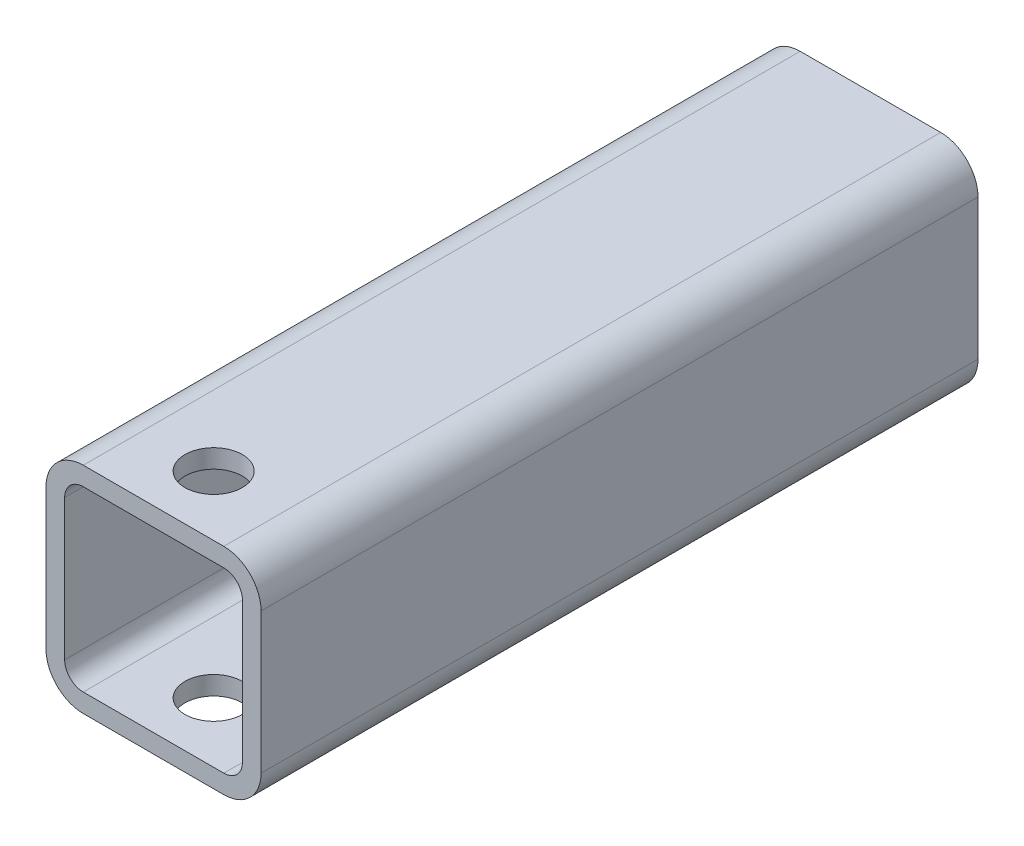
ISO-10303-21;
HEADER;
FILE_DESCRIPTION(('STEP AP214'),'2;1');
FILE_NAME('part.step','',(''),(''),'','','');
FILE_SCHEMA(('AUTOMOTIVE_DESIGN { 1 0 10303 214 1 1 1 1 }'));
ENDSEC;
DATA;
#1=APPLICATION_CONTEXT('core data for automotive mechanical design processes');
#2=APPLICATION_PROTOCOL_DEFINITION('international standard','automotive_design',2000,#1);
#3=PRODUCT_CONTEXT('',#1,'mechanical');
#4=PRODUCT('Part','Part','',(#3));
#5=PRODUCT_RELATED_PRODUCT_CATEGORY('part','',(#4));
#6=PRODUCT_DEFINITION_FORMATION('','',#4);
#7=PRODUCT_DEFINITION_CONTEXT('part definition',#1,'design');
#8=PRODUCT_DEFINITION('design','',#6,#7);
#9=PRODUCT_DEFINITION_SHAPE('','',#8);
#10=(LENGTH_UNIT() NAMED_UNIT(*) SI_UNIT(.MILLI.,.METRE.));
#11=(NAMED_UNIT(*) PLANE_ANGLE_UNIT() SI_UNIT($,.RADIAN.));
#12=(NAMED_UNIT(*) SI_UNIT($,.STERADIAN.) SOLID_ANGLE_UNIT());
#13=UNCERTAINTY_MEASURE_WITH_UNIT(LENGTH_MEASURE(1.E-05),#10,'distance_accuracy_value','');
#14=(GEOMETRIC_REPRESENTATION_CONTEXT(3) GLOBAL_UNCERTAINTY_ASSIGNED_CONTEXT((#13)) GLOBAL_UNIT_ASSIGNED_CONTEXT((#10,
#11,#12)) REPRESENTATION_CONTEXT('',''));
#15=CARTESIAN_POINT('',(0.,0.,0.));
#16=DIRECTION('',(0.,0.,1.));
#17=DIRECTION('',(1.,0.,0.));
#18=AXIS2_PLACEMENT_3D('',#15,#16,#17);
#19=CARTESIAN_POINT('',(-9.8,-12.4,31.9179648781356));
#20=DIRECTION('',(0.,1.,0.));
#21=DIRECTION('',(0.,0.,1.));
#22=AXIS2_PLACEMENT_3D('',#19,#20,#21);
#23=PLANE('',#22);
#24=CARTESIAN_POINT('',(0.,-12.4,23.5324288939167));
#25=DIRECTION('',(0.,1.,0.));
#26=DIRECTION('',(0.,0.,1.));
#27=AXIS2_PLACEMENT_3D('',#24,#25,#26);
#28=CIRCLE('',#27,4.);
#29=CARTESIAN_POINT('',(0.,-12.4,27.5324288939167));
#30=VERTEX_POINT('',#29);
#31=EDGE_CURVE('E177',#30,#30,#28,.T.);
#32=ORIENTED_EDGE('',*,*,#31,.F.);
#33=EDGE_LOOP('',(#32));
#34=FACE_BOUND('',#33,.T.);
#35=DIRECTION('',(0.,0.,-1.));
#36=VECTOR('',#35,1.);
#37=CARTESIAN_POINT('',(9.8,-12.4,31.9179648781356));
#38=LINE('',#37,#36);
#39=CARTESIAN_POINT('',(9.8,-12.4,31.9179648781356));
#40=VERTEX_POINT('',#39);
#41=CARTESIAN_POINT('',(9.8,-12.4,-68.0820351218644));
#42=VERTEX_POINT('',#41);
#43=EDGE_CURVE('E125',#40,#42,#38,.T.);
#44=ORIENTED_EDGE('',*,*,#43,.T.);
#45=DIRECTION('',(-1.,0.,0.));
#46=VECTOR('',#45,1.);
#47=CARTESIAN_POINT('',(-9.8,-12.4,-68.0820351218644));
#48=LINE('',#47,#46);
#49=CARTESIAN_POINT('',(-9.8,-12.4,-68.0820351218644));
#50=VERTEX_POINT('',#49);
#51=EDGE_CURVE('E156',#42,#50,#48,.T.);
#52=ORIENTED_EDGE('',*,*,#51,.T.);
#53=DIRECTION('',(0.,0.,-1.));
#54=VECTOR('',#53,1.);
#55=CARTESIAN_POINT('',(-9.8,-12.4,31.9179648781356));
#56=LINE('',#55,#54);
#57=CARTESIAN_POINT('',(-9.8,-12.4,31.9179648781356));
#58=VERTEX_POINT('',#57);
#59=EDGE_CURVE('E127',#58,#50,#56,.T.);
#60=ORIENTED_EDGE('',*,*,#59,.F.);
#61=DIRECTION('',(-1.,0.,0.));
#62=VECTOR('',#61,1.);
#63=CARTESIAN_POINT('',(-9.8,-12.4,31.9179648781356));
#64=LINE('',#63,#62);
#65=EDGE_CURVE('E123',#40,#58,#64,.T.);
#66=ORIENTED_EDGE('',*,*,#65,.F.);
#67=EDGE_LOOP('',(#44,#52,#60,#66));
#68=FACE_BOUND('',#67,.T.);
#69=ADVANCED_FACE('F43',(#34,#68),#23,.T.);
#70=CARTESIAN_POINT('',(9.8,-9.8,31.9179648781356));
#71=DIRECTION('',(0.,0.,-1.));
#72=DIRECTION('',(-1.,0.,0.));
#73=AXIS2_PLACEMENT_3D('',#70,#71,#72);
#74=CYLINDRICAL_SURFACE('',#73,2.6);
#75=DIRECTION('',(0.,0.,-1.));
#76=VECTOR('',#75,1.);
#77=CARTESIAN_POINT('',(12.4,-9.8,31.9179648781356));
#78=LINE('',#77,#76);
#79=CARTESIAN_POINT('',(12.4,-9.8,31.9179648781356));
#80=VERTEX_POINT('',#79);
#81=CARTESIAN_POINT('',(12.4,-9.8,-68.0820351218644));
#82=VERTEX_POINT('',#81);
#83=EDGE_CURVE('E140',#80,#82,#78,.T.);
#84=ORIENTED_EDGE('',*,*,#83,.T.);
#85=CARTESIAN_POINT('',(9.8,-9.8,-68.0820351218644));
#86=DIRECTION('',(0.,0.,-1.));
#87=DIRECTION('',(-1.,0.,0.));
#88=AXIS2_PLACEMENT_3D('',#85,#86,#87);
#89=CIRCLE('',#88,2.6);
#90=EDGE_CURVE('E131',#82,#42,#89,.T.);
#91=ORIENTED_EDGE('',*,*,#90,.T.);
#92=ORIENTED_EDGE('',*,*,#43,.F.);
#93=CARTESIAN_POINT('',(9.8,-9.8,31.9179648781356));
#94=DIRECTION('',(0.,0.,-1.));
#95=DIRECTION('',(-1.,0.,0.));
#96=AXIS2_PLACEMENT_3D('',#93,#94,#95);
#97=CIRCLE('',#96,2.6);
#98=EDGE_CURVE('E136',#80,#40,#97,.T.);
#99=ORIENTED_EDGE('',*,*,#98,.F.);
#100=EDGE_LOOP('',(#84,#91,#92,#99));
#101=FACE_BOUND('',#100,.T.);
#102=ADVANCED_FACE('F135',(#101),#74,.F.);
#103=CARTESIAN_POINT('',(12.4,9.8,31.9179648781356));
#104=DIRECTION('',(-1.,0.,0.));
#105=DIRECTION('',(0.,0.,1.));
#106=AXIS2_PLACEMENT_3D('',#103,#104,#105);
#107=PLANE('',#106);
#108=DIRECTION('',(0.,0.,-1.));
#109=VECTOR('',#108,1.);
#110=CARTESIAN_POINT('',(12.4,9.8,31.9179648781356));
#111=LINE('',#110,#109);
#112=CARTESIAN_POINT('',(12.4,9.8,31.9179648781356));
#113=VERTEX_POINT('',#112);
#114=CARTESIAN_POINT('',(12.4,9.8,-68.0820351218644));
#115=VERTEX_POINT('',#114);
#116=EDGE_CURVE('E180',#113,#115,#111,.T.);
#117=ORIENTED_EDGE('',*,*,#116,.T.);
#118=DIRECTION('',(0.,-1.,0.));
#119=VECTOR('',#118,1.);
#120=CARTESIAN_POINT('',(12.4,9.8,-68.0820351218644));
#121=LINE('',#120,#119);
#122=EDGE_CURVE('E317',#115,#82,#121,.T.);
#123=ORIENTED_EDGE('',*,*,#122,.T.);
#124=ORIENTED_EDGE('',*,*,#83,.F.);
#125=DIRECTION('',(0.,-1.,0.));
#126=VECTOR('',#125,1.);
#127=CARTESIAN_POINT('',(12.4,9.8,31.9179648781356));
#128=LINE('',#127,#126);
#129=EDGE_CURVE('E146',#113,#80,#128,.T.);
#130=ORIENTED_EDGE('',*,*,#129,.F.);
#131=EDGE_LOOP('',(#117,#123,#124,#130));
#132=FACE_BOUND('',#131,.T.);
#133=ADVANCED_FACE('F326',(#132),#107,.T.);
#134=CARTESIAN_POINT('',(9.8,9.8,31.9179648781356));
#135=DIRECTION('',(0.,0.,-1.));
#136=DIRECTION('',(-1.,0.,0.));
#137=AXIS2_PLACEMENT_3D('',#134,#135,#136);
#138=CYLINDRICAL_SURFACE('',#137,2.6);
#139=DIRECTION('',(0.,0.,-1.));
#140=VECTOR('',#139,1.);
#141=CARTESIAN_POINT('',(9.8,12.4,31.9179648781356));
#142=LINE('',#141,#140);
#143=CARTESIAN_POINT('',(9.8,12.4,31.9179648781356));
#144=VERTEX_POINT('',#143);
#145=CARTESIAN_POINT('',(9.8,12.4,-68.0820351218644));
#146=VERTEX_POINT('',#145);
#147=EDGE_CURVE('E184',#144,#146,#142,.T.);
#148=ORIENTED_EDGE('',*,*,#147,.T.);
#149=CARTESIAN_POINT('',(9.8,9.8,-68.0820351218644));
#150=DIRECTION('',(0.,0.,-1.));
#151=DIRECTION('',(-1.,0.,0.));
#152=AXIS2_PLACEMENT_3D('',#149,#150,#151);
#153=CIRCLE('',#152,2.6);
#154=EDGE_CURVE('E214',#146,#115,#153,.T.);
#155=ORIENTED_EDGE('',*,*,#154,.T.);
#156=ORIENTED_EDGE('',*,*,#116,.F.);
#157=CARTESIAN_POINT('',(9.8,9.8,31.9179648781356));
#158=DIRECTION('',(0.,0.,-1.));
#159=DIRECTION('',(-1.,0.,0.));
#160=AXIS2_PLACEMENT_3D('',#157,#158,#159);
#161=CIRCLE('',#160,2.6);
#162=EDGE_CURVE('E151',#144,#113,#161,.T.);
#163=ORIENTED_EDGE('',*,*,#162,.F.);
#164=EDGE_LOOP('',(#148,#155,#156,#163));
#165=FACE_BOUND('',#164,.T.);
#166=ADVANCED_FACE('F322',(#165),#138,.F.);
#167=CARTESIAN_POINT('',(9.8,12.4,31.9179648781356));
#168=DIRECTION('',(0.,-1.,0.));
#169=DIRECTION('',(0.,0.,-1.));
#170=AXIS2_PLACEMENT_3D('',#167,#168,#169);
#171=PLANE('',#170);
#172=CARTESIAN_POINT('',(0.,12.4,23.5324288939167));
#173=DIRECTION('',(0.,-1.,0.));
#174=DIRECTION('',(0.,0.,-1.));
#175=AXIS2_PLACEMENT_3D('',#172,#173,#174);
#176=CIRCLE('',#175,4.);
#177=CARTESIAN_POINT('',(0.,12.4,19.5324288939167));
#178=VERTEX_POINT('',#177);
#179=EDGE_CURVE('E366',#178,#178,#176,.T.);
#180=ORIENTED_EDGE('',*,*,#179,.F.);
#181=EDGE_LOOP('',(#180));
#182=FACE_BOUND('',#181,.T.);
#183=DIRECTION('',(0.,0.,-1.));
#184=VECTOR('',#183,1.);
#185=CARTESIAN_POINT('',(-9.8,12.4,31.9179648781356));
#186=LINE('',#185,#184);
#187=CARTESIAN_POINT('',(-9.8,12.4,31.9179648781356));
#188=VERTEX_POINT('',#187);
#189=CARTESIAN_POINT('',(-9.8,12.4,-68.0820351218644));
#190=VERTEX_POINT('',#189);
#191=EDGE_CURVE('E188',#188,#190,#186,.T.);
#192=ORIENTED_EDGE('',*,*,#191,.T.);
#193=DIRECTION('',(1.,0.,0.));
#194=VECTOR('',#193,1.);
#195=CARTESIAN_POINT('',(9.8,12.4,-68.0820351218644));
#196=LINE('',#195,#194);
#197=EDGE_CURVE('E207',#190,#146,#196,.T.);
#198=ORIENTED_EDGE('',*,*,#197,.T.);
#199=ORIENTED_EDGE('',*,*,#147,.F.);
#200=DIRECTION('',(1.,0.,0.));
#201=VECTOR('',#200,1.);
#202=CARTESIAN_POINT('',(9.8,12.4,31.9179648781356));
#203=LINE('',#202,#201);
#204=EDGE_CURVE('E161',#188,#144,#203,.T.);
#205=ORIENTED_EDGE('',*,*,#204,.F.);
#206=EDGE_LOOP('',(#192,#198,#199,#205));
#207=FACE_BOUND('',#206,.T.);
#208=ADVANCED_FACE('F333',(#182,#207),#171,.T.);
#209=CARTESIAN_POINT('',(-9.8,9.8,31.9179648781356));
#210=DIRECTION('',(0.,0.,-1.));
#211=DIRECTION('',(-1.,0.,0.));
#212=AXIS2_PLACEMENT_3D('',#209,#210,#211);
#213=CYLINDRICAL_SURFACE('',#212,2.6);
#214=DIRECTION('',(0.,0.,-1.));
#215=VECTOR('',#214,1.);
#216=CARTESIAN_POINT('',(-12.4,9.8,31.9179648781356));
#217=LINE('',#216,#215);
#218=CARTESIAN_POINT('',(-12.4,9.8,31.9179648781356));
#219=VERTEX_POINT('',#218);
#220=CARTESIAN_POINT('',(-12.4,9.8,-68.0820351218644));
#221=VERTEX_POINT('',#220);
#222=EDGE_CURVE('E154',#219,#221,#217,.T.);
#223=ORIENTED_EDGE('',*,*,#222,.T.);
#224=CARTESIAN_POINT('',(-9.8,9.8,-68.0820351218644));
#225=DIRECTION('',(0.,0.,-1.));
#226=DIRECTION('',(-1.,0.,0.));
#227=AXIS2_PLACEMENT_3D('',#224,#225,#226);
#228=CIRCLE('',#227,2.6);
#229=EDGE_CURVE('E198',#221,#190,#228,.T.);
#230=ORIENTED_EDGE('',*,*,#229,.T.);
#231=ORIENTED_EDGE('',*,*,#191,.F.);
#232=CARTESIAN_POINT('',(-9.8,9.8,31.9179648781356));
#233=DIRECTION('',(0.,0.,-1.));
#234=DIRECTION('',(-1.,0.,0.));
#235=AXIS2_PLACEMENT_3D('',#232,#233,#234);
#236=CIRCLE('',#235,2.6);
#237=EDGE_CURVE('E165',#219,#188,#236,.T.);
#238=ORIENTED_EDGE('',*,*,#237,.F.);
#239=EDGE_LOOP('',(#223,#230,#231,#238));
#240=FACE_BOUND('',#239,.T.);
#241=ADVANCED_FACE('F196',(#240),#213,.F.);
#242=CARTESIAN_POINT('',(-12.4,-9.8,31.9179648781356));
#243=DIRECTION('',(1.,0.,0.));
#244=DIRECTION('',(0.,0.,-1.));
#245=AXIS2_PLACEMENT_3D('',#242,#243,#244);
#246=PLANE('',#245);
#247=DIRECTION('',(0.,0.,-1.));
#248=VECTOR('',#247,1.);
#249=CARTESIAN_POINT('',(-12.4,-9.8,31.9179648781356));
#250=LINE('',#249,#248);
#251=CARTESIAN_POINT('',(-12.4,-9.8,31.9179648781356));
#252=VERTEX_POINT('',#251);
#253=CARTESIAN_POINT('',(-12.4,-9.8,-68.0820351218644));
#254=VERTEX_POINT('',#253);
#255=EDGE_CURVE('E47',#252,#254,#250,.T.);
#256=ORIENTED_EDGE('',*,*,#255,.T.);
#257=DIRECTION('',(0.,1.,0.));
#258=VECTOR('',#257,1.);
#259=CARTESIAN_POINT('',(-12.4,-9.8,-68.0820351218644));
#260=LINE('',#259,#258);
#261=EDGE_CURVE('E205',#254,#221,#260,.T.);
#262=ORIENTED_EDGE('',*,*,#261,.T.);
#263=ORIENTED_EDGE('',*,*,#222,.F.);
#264=DIRECTION('',(0.,1.,0.));
#265=VECTOR('',#264,1.);
#266=CARTESIAN_POINT('',(-12.4,-9.8,31.9179648781356));
#267=LINE('',#266,#265);
#268=EDGE_CURVE('E169',#252,#219,#267,.T.);
#269=ORIENTED_EDGE('',*,*,#268,.F.);
#270=EDGE_LOOP('',(#256,#262,#263,#269));
#271=FACE_BOUND('',#270,.T.);
#272=ADVANCED_FACE('F548',(#271),#246,.T.);
#273=CARTESIAN_POINT('',(-9.8,-9.8,31.9179648781356));
#274=DIRECTION('',(0.,0.,-1.));
#275=DIRECTION('',(-1.,0.,0.));
#276=AXIS2_PLACEMENT_3D('',#273,#274,#275);
#277=CYLINDRICAL_SURFACE('',#276,2.6);
#278=CARTESIAN_POINT('',(-9.8,-9.8,-68.0820351218644));
#279=DIRECTION('',(0.,0.,-1.));
#280=DIRECTION('',(-1.,0.,0.));
#281=AXIS2_PLACEMENT_3D('',#278,#279,#280);
#282=CIRCLE('',#281,2.6);
#283=EDGE_CURVE('E212',#50,#254,#282,.T.);
#284=ORIENTED_EDGE('',*,*,#283,.T.);
#285=ORIENTED_EDGE('',*,*,#255,.F.);
#286=CARTESIAN_POINT('',(-9.8,-9.8,31.9179648781356));
#287=DIRECTION('',(0.,0.,-1.));
#288=DIRECTION('',(-1.,0.,0.));
#289=AXIS2_PLACEMENT_3D('',#286,#287,#288);
#290=CIRCLE('',#289,2.6);
#291=EDGE_CURVE('E117',#58,#252,#290,.T.);
#292=ORIENTED_EDGE('',*,*,#291,.F.);
#293=ORIENTED_EDGE('',*,*,#59,.T.);
#294=EDGE_LOOP('',(#284,#285,#292,#293));
#295=FACE_BOUND('',#294,.T.);
#296=ADVANCED_FACE('F45',(#295),#277,.F.);
#297=CARTESIAN_POINT('',(9.8,9.8,31.9179648781356));
#298=DIRECTION('',(0.,0.,-1.));
#299=DIRECTION('',(-1.,0.,0.));
#300=AXIS2_PLACEMENT_3D('',#297,#298,#299);
#301=PLANE('',#300);
#302=ORIENTED_EDGE('',*,*,#98,.T.);
#303=ORIENTED_EDGE('',*,*,#65,.T.);
#304=ORIENTED_EDGE('',*,*,#291,.T.);
#305=ORIENTED_EDGE('',*,*,#268,.T.);
#306=ORIENTED_EDGE('',*,*,#237,.T.);
#307=ORIENTED_EDGE('',*,*,#204,.T.);
#308=ORIENTED_EDGE('',*,*,#162,.T.);
#309=ORIENTED_EDGE('',*,*,#129,.T.);
#310=EDGE_LOOP('',(#302,#303,#304,#305,#306,#307,#308,#309));
#311=FACE_BOUND('',#310,.T.);
#312=CARTESIAN_POINT('',(9.8,9.8,31.9179648781356));
#313=DIRECTION('',(0.,0.,-1.));
#314=DIRECTION('',(-1.,0.,0.));
#315=AXIS2_PLACEMENT_3D('',#312,#313,#314);
#316=CIRCLE('',#315,5.2);
#317=CARTESIAN_POINT('',(9.8,15.,31.9179648781356));
#318=VERTEX_POINT('',#317);
#319=CARTESIAN_POINT('',(15.,9.8,31.9179648781356));
#320=VERTEX_POINT('',#319);
#321=EDGE_CURVE('E222',#318,#320,#316,.T.);
#322=ORIENTED_EDGE('',*,*,#321,.F.);
#323=DIRECTION('',(1.,0.,0.));
#324=VECTOR('',#323,1.);
#325=CARTESIAN_POINT('',(9.8,15.,31.9179648781356));
#326=LINE('',#325,#324);
#327=CARTESIAN_POINT('',(-9.8,15.,31.9179648781356));
#328=VERTEX_POINT('',#327);
#329=EDGE_CURVE('E219',#328,#318,#326,.T.);
#330=ORIENTED_EDGE('',*,*,#329,.F.);
#331=CARTESIAN_POINT('',(-9.8,9.8,31.9179648781356));
#332=DIRECTION('',(0.,0.,-1.));
#333=DIRECTION('',(-1.,0.,0.));
#334=AXIS2_PLACEMENT_3D('',#331,#332,#333);
#335=CIRCLE('',#334,5.2);
#336=CARTESIAN_POINT('',(-15.,9.8,31.9179648781356));
#337=VERTEX_POINT('',#336);
#338=EDGE_CURVE('E248',#337,#328,#335,.T.);
#339=ORIENTED_EDGE('',*,*,#338,.F.);
#340=DIRECTION('',(0.,1.,0.));
#341=VECTOR('',#340,1.);
#342=CARTESIAN_POINT('',(-15.,-9.8,31.9179648781356));
#343=LINE('',#342,#341);
#344=CARTESIAN_POINT('',(-15.,-9.8,31.9179648781356));
#345=VERTEX_POINT('',#344);
#346=EDGE_CURVE('E297',#345,#337,#343,.T.);
#347=ORIENTED_EDGE('',*,*,#346,.F.);
#348=CARTESIAN_POINT('',(-9.8,-9.8,31.9179648781356));
#349=DIRECTION('',(0.,0.,-1.));
#350=DIRECTION('',(-1.,0.,0.));
#351=AXIS2_PLACEMENT_3D('',#348,#349,#350);
#352=CIRCLE('',#351,5.2);
#353=CARTESIAN_POINT('',(-9.8,-15.,31.9179648781356));
#354=VERTEX_POINT('',#353);
#355=EDGE_CURVE('E285',#354,#345,#352,.T.);
#356=ORIENTED_EDGE('',*,*,#355,.F.);
#357=DIRECTION('',(-1.,0.,0.));
#358=VECTOR('',#357,1.);
#359=CARTESIAN_POINT('',(-9.8,-15.,31.9179648781356));
#360=LINE('',#359,#358);
#361=CARTESIAN_POINT('',(9.8,-15.,31.9179648781356));
#362=VERTEX_POINT('',#361);
#363=EDGE_CURVE('E273',#362,#354,#360,.T.);
#364=ORIENTED_EDGE('',*,*,#363,.F.);
#365=CARTESIAN_POINT('',(9.8,-9.8,31.9179648781356));
#366=DIRECTION('',(0.,0.,-1.));
#367=DIRECTION('',(-1.,0.,0.));
#368=AXIS2_PLACEMENT_3D('',#365,#366,#367);
#369=CIRCLE('',#368,5.2);
#370=CARTESIAN_POINT('',(15.,-9.8,31.9179648781356));
#371=VERTEX_POINT('',#370);
#372=EDGE_CURVE('E261',#371,#362,#369,.T.);
#373=ORIENTED_EDGE('',*,*,#372,.F.);
#374=DIRECTION('',(0.,-1.,0.));
#375=VECTOR('',#374,1.);
#376=CARTESIAN_POINT('',(15.,9.8,31.9179648781356));
#377=LINE('',#376,#375);
#378=EDGE_CURVE('E232',#320,#371,#377,.T.);
#379=ORIENTED_EDGE('',*,*,#378,.F.);
#380=EDGE_LOOP('',(#322,#330,#339,#347,#356,#364,#373,#379));
#381=FACE_BOUND('',#380,.T.);
#382=ADVANCED_FACE('F143',(#311,#381),#301,.F.);
#383=CARTESIAN_POINT('',(9.8,9.8,-68.0820351218644));
#384=DIRECTION('',(0.,0.,-1.));
#385=DIRECTION('',(-1.,0.,0.));
#386=AXIS2_PLACEMENT_3D('',#383,#384,#385);
#387=PLANE('',#386);
#388=ORIENTED_EDGE('',*,*,#90,.F.);
#389=ORIENTED_EDGE('',*,*,#122,.F.);
#390=ORIENTED_EDGE('',*,*,#154,.F.);
#391=ORIENTED_EDGE('',*,*,#197,.F.);
#392=ORIENTED_EDGE('',*,*,#229,.F.);
#393=ORIENTED_EDGE('',*,*,#261,.F.);
#394=ORIENTED_EDGE('',*,*,#283,.F.);
#395=ORIENTED_EDGE('',*,*,#51,.F.);
#396=EDGE_LOOP('',(#388,#389,#390,#391,#392,#393,#394,#395));
#397=FACE_BOUND('',#396,.T.);
#398=CARTESIAN_POINT('',(9.8,9.8,-68.0820351218644));
#399=DIRECTION('',(0.,0.,-1.));
#400=DIRECTION('',(-1.,0.,0.));
#401=AXIS2_PLACEMENT_3D('',#398,#399,#400);
#402=CIRCLE('',#401,5.2);
#403=CARTESIAN_POINT('',(9.8,15.,-68.0820351218644));
#404=VERTEX_POINT('',#403);
#405=CARTESIAN_POINT('',(15.,9.8,-68.0820351218644));
#406=VERTEX_POINT('',#405);
#407=EDGE_CURVE('E245',#404,#406,#402,.T.);
#408=ORIENTED_EDGE('',*,*,#407,.T.);
#409=DIRECTION('',(0.,-1.,0.));
#410=VECTOR('',#409,1.);
#411=CARTESIAN_POINT('',(15.,9.8,-68.0820351218644));
#412=LINE('',#411,#410);
#413=CARTESIAN_POINT('',(15.,-9.8,-68.0820351218644));
#414=VERTEX_POINT('',#413);
#415=EDGE_CURVE('E257',#406,#414,#412,.T.);
#416=ORIENTED_EDGE('',*,*,#415,.T.);
#417=CARTESIAN_POINT('',(9.8,-9.8,-68.0820351218644));
#418=DIRECTION('',(0.,0.,-1.));
#419=DIRECTION('',(-1.,0.,0.));
#420=AXIS2_PLACEMENT_3D('',#417,#418,#419);
#421=CIRCLE('',#420,5.2);
#422=CARTESIAN_POINT('',(9.8,-15.,-68.0820351218644));
#423=VERTEX_POINT('',#422);
#424=EDGE_CURVE('E269',#414,#423,#421,.T.);
#425=ORIENTED_EDGE('',*,*,#424,.T.);
#426=DIRECTION('',(-1.,0.,0.));
#427=VECTOR('',#426,1.);
#428=CARTESIAN_POINT('',(-9.8,-15.,-68.0820351218644));
#429=LINE('',#428,#427);
#430=CARTESIAN_POINT('',(-9.8,-15.,-68.0820351218644));
#431=VERTEX_POINT('',#430);
#432=EDGE_CURVE('E281',#423,#431,#429,.T.);
#433=ORIENTED_EDGE('',*,*,#432,.T.);
#434=CARTESIAN_POINT('',(-9.8,-9.8,-68.0820351218644));
#435=DIRECTION('',(0.,0.,-1.));
#436=DIRECTION('',(-1.,0.,0.));
#437=AXIS2_PLACEMENT_3D('',#434,#435,#436);
#438=CIRCLE('',#437,5.2);
#439=CARTESIAN_POINT('',(-15.,-9.8,-68.0820351218644));
#440=VERTEX_POINT('',#439);
#441=EDGE_CURVE('E293',#431,#440,#438,.T.);
#442=ORIENTED_EDGE('',*,*,#441,.T.);
#443=DIRECTION('',(0.,1.,0.));
#444=VECTOR('',#443,1.);
#445=CARTESIAN_POINT('',(-15.,-9.8,-68.0820351218644));
#446=LINE('',#445,#444);
#447=CARTESIAN_POINT('',(-15.,9.8,-68.0820351218644));
#448=VERTEX_POINT('',#447);
#449=EDGE_CURVE('E62',#440,#448,#446,.T.);
#450=ORIENTED_EDGE('',*,*,#449,.T.);
#451=CARTESIAN_POINT('',(-9.8,9.8,-68.0820351218644));
#452=DIRECTION('',(0.,0.,-1.));
#453=DIRECTION('',(-1.,0.,0.));
#454=AXIS2_PLACEMENT_3D('',#451,#452,#453);
#455=CIRCLE('',#454,5.2);
#456=CARTESIAN_POINT('',(-9.8,15.,-68.0820351218644));
#457=VERTEX_POINT('',#456);
#458=EDGE_CURVE('E11',#448,#457,#455,.T.);
#459=ORIENTED_EDGE('',*,*,#458,.T.);
#460=DIRECTION('',(1.,0.,0.));
#461=VECTOR('',#460,1.);
#462=CARTESIAN_POINT('',(9.8,15.,-68.0820351218644));
#463=LINE('',#462,#461);
#464=EDGE_CURVE('E237',#457,#404,#463,.T.);
#465=ORIENTED_EDGE('',*,*,#464,.T.);
#466=EDGE_LOOP('',(#408,#416,#425,#433,#442,#450,#459,#465));
#467=FACE_BOUND('',#466,.T.);
#468=ADVANCED_FACE('F203',(#397,#467),#387,.T.);
#469=CARTESIAN_POINT('',(9.8,15.,31.9179648781356));
#470=DIRECTION('',(0.,1.,0.));
#471=DIRECTION('',(0.,0.,1.));
#472=AXIS2_PLACEMENT_3D('',#469,#470,#471);
#473=PLANE('',#472);
#474=CARTESIAN_POINT('',(0.,15.,23.5324288939167));
#475=DIRECTION('',(0.,1.,0.));
#476=DIRECTION('',(0.,0.,1.));
#477=AXIS2_PLACEMENT_3D('',#474,#475,#476);
#478=CIRCLE('',#477,4.);
#479=CARTESIAN_POINT('',(0.,15.,27.5324288939167));
#480=VERTEX_POINT('',#479);
#481=EDGE_CURVE('E374',#480,#480,#478,.T.);
#482=ORIENTED_EDGE('',*,*,#481,.F.);
#483=EDGE_LOOP('',(#482));
#484=FACE_BOUND('',#483,.T.);
#485=DIRECTION('',(0.,0.,-1.));
#486=VECTOR('',#485,1.);
#487=CARTESIAN_POINT('',(9.8,15.,31.9179648781356));
#488=LINE('',#487,#486);
#489=EDGE_CURVE('E241',#318,#404,#488,.T.);
#490=ORIENTED_EDGE('',*,*,#489,.T.);
#491=ORIENTED_EDGE('',*,*,#464,.F.);
#492=DIRECTION('',(0.,0.,-1.));
#493=VECTOR('',#492,1.);
#494=CARTESIAN_POINT('',(-9.8,15.,31.9179648781356));
#495=LINE('',#494,#493);
#496=EDGE_CURVE('E242',#328,#457,#495,.T.);
#497=ORIENTED_EDGE('',*,*,#496,.F.);
#498=ORIENTED_EDGE('',*,*,#329,.T.);
#499=EDGE_LOOP('',(#490,#491,#497,#498));
#500=FACE_BOUND('',#499,.T.);
#501=ADVANCED_FACE('F356',(#484,#500),#473,.T.);
#502=CARTESIAN_POINT('',(9.8,9.8,31.9179648781356));
#503=DIRECTION('',(0.,0.,-1.));
#504=DIRECTION('',(-1.,0.,0.));
#505=AXIS2_PLACEMENT_3D('',#502,#503,#504);
#506=CYLINDRICAL_SURFACE('',#505,5.2);
#507=DIRECTION('',(0.,0.,-1.));
#508=VECTOR('',#507,1.);
#509=CARTESIAN_POINT('',(15.,9.8,31.9179648781356));
#510=LINE('',#509,#508);
#511=EDGE_CURVE('E253',#320,#406,#510,.T.);
#512=ORIENTED_EDGE('',*,*,#511,.T.);
#513=ORIENTED_EDGE('',*,*,#407,.F.);
#514=ORIENTED_EDGE('',*,*,#489,.F.);
#515=ORIENTED_EDGE('',*,*,#321,.T.);
#516=EDGE_LOOP('',(#512,#513,#514,#515));
#517=FACE_BOUND('',#516,.T.);
#518=ADVANCED_FACE('F383',(#517),#506,.T.);
#519=CARTESIAN_POINT('',(15.,9.8,31.9179648781356));
#520=DIRECTION('',(1.,0.,0.));
#521=DIRECTION('',(0.,0.,-1.));
#522=AXIS2_PLACEMENT_3D('',#519,#520,#521);
#523=PLANE('',#522);
#524=DIRECTION('',(0.,0.,-1.));
#525=VECTOR('',#524,1.);
#526=CARTESIAN_POINT('',(15.,-9.8,31.9179648781356));
#527=LINE('',#526,#525);
#528=EDGE_CURVE('E265',#371,#414,#527,.T.);
#529=ORIENTED_EDGE('',*,*,#528,.T.);
#530=ORIENTED_EDGE('',*,*,#415,.F.);
#531=ORIENTED_EDGE('',*,*,#511,.F.);
#532=ORIENTED_EDGE('',*,*,#378,.T.);
#533=EDGE_LOOP('',(#529,#530,#531,#532));
#534=FACE_BOUND('',#533,.T.);
#535=ADVANCED_FACE('F424',(#534),#523,.T.);
#536=CARTESIAN_POINT('',(9.8,-9.8,31.9179648781356));
#537=DIRECTION('',(0.,0.,-1.));
#538=DIRECTION('',(-1.,0.,0.));
#539=AXIS2_PLACEMENT_3D('',#536,#537,#538);
#540=CYLINDRICAL_SURFACE('',#539,5.2);
#541=DIRECTION('',(0.,0.,-1.));
#542=VECTOR('',#541,1.);
#543=CARTESIAN_POINT('',(9.8,-15.,31.9179648781356));
#544=LINE('',#543,#542);
#545=EDGE_CURVE('E277',#362,#423,#544,.T.);
#546=ORIENTED_EDGE('',*,*,#545,.T.);
#547=ORIENTED_EDGE('',*,*,#424,.F.);
#548=ORIENTED_EDGE('',*,*,#528,.F.);
#549=ORIENTED_EDGE('',*,*,#372,.T.);
#550=EDGE_LOOP('',(#546,#547,#548,#549));
#551=FACE_BOUND('',#550,.T.);
#552=ADVANCED_FACE('F427',(#551),#540,.T.);
#553=CARTESIAN_POINT('',(-9.8,-15.,31.9179648781356));
#554=DIRECTION('',(0.,-1.,0.));
#555=DIRECTION('',(0.,0.,-1.));
#556=AXIS2_PLACEMENT_3D('',#553,#554,#555);
#557=PLANE('',#556);
#558=CARTESIAN_POINT('',(0.,-15.,23.5324288939167));
#559=DIRECTION('',(0.,-1.,0.));
#560=DIRECTION('',(0.,0.,-1.));
#561=AXIS2_PLACEMENT_3D('',#558,#559,#560);
#562=CIRCLE('',#561,4.);
#563=CARTESIAN_POINT('',(0.,-15.,19.5324288939167));
#564=VERTEX_POINT('',#563);
#565=EDGE_CURVE('E369',#564,#564,#562,.F.);
#566=ORIENTED_EDGE('',*,*,#565,.T.);
#567=EDGE_LOOP('',(#566));
#568=FACE_BOUND('',#567,.T.);
#569=DIRECTION('',(0.,0.,-1.));
#570=VECTOR('',#569,1.);
#571=CARTESIAN_POINT('',(-9.8,-15.,31.9179648781356));
#572=LINE('',#571,#570);
#573=EDGE_CURVE('E289',#354,#431,#572,.T.);
#574=ORIENTED_EDGE('',*,*,#573,.T.);
#575=ORIENTED_EDGE('',*,*,#432,.F.);
#576=ORIENTED_EDGE('',*,*,#545,.F.);
#577=ORIENTED_EDGE('',*,*,#363,.T.);
#578=EDGE_LOOP('',(#574,#575,#576,#577));
#579=FACE_BOUND('',#578,.T.);
#580=ADVANCED_FACE('F432',(#568,#579),#557,.T.);
#581=CARTESIAN_POINT('',(-9.8,-9.8,31.9179648781356));
#582=DIRECTION('',(0.,0.,-1.));
#583=DIRECTION('',(-1.,0.,0.));
#584=AXIS2_PLACEMENT_3D('',#581,#582,#583);
#585=CYLINDRICAL_SURFACE('',#584,5.2);
#586=DIRECTION('',(0.,0.,-1.));
#587=VECTOR('',#586,1.);
#588=CARTESIAN_POINT('',(-15.,-9.8,31.9179648781356));
#589=LINE('',#588,#587);
#590=EDGE_CURVE('E300',#345,#440,#589,.T.);
#591=ORIENTED_EDGE('',*,*,#590,.T.);
#592=ORIENTED_EDGE('',*,*,#441,.F.);
#593=ORIENTED_EDGE('',*,*,#573,.F.);
#594=ORIENTED_EDGE('',*,*,#355,.T.);
#595=EDGE_LOOP('',(#591,#592,#593,#594));
#596=FACE_BOUND('',#595,.T.);
#597=ADVANCED_FACE('F349',(#596),#585,.T.);
#598=CARTESIAN_POINT('',(-15.,-9.8,31.9179648781356));
#599=DIRECTION('',(-1.,0.,0.));
#600=DIRECTION('',(0.,0.,1.));
#601=AXIS2_PLACEMENT_3D('',#598,#599,#600);
#602=PLANE('',#601);
#603=DIRECTION('',(0.,0.,-1.));
#604=VECTOR('',#603,1.);
#605=CARTESIAN_POINT('',(-15.,9.8,31.9179648781356));
#606=LINE('',#605,#604);
#607=EDGE_CURVE('E54',#337,#448,#606,.T.);
#608=ORIENTED_EDGE('',*,*,#607,.T.);
#609=ORIENTED_EDGE('',*,*,#449,.F.);
#610=ORIENTED_EDGE('',*,*,#590,.F.);
#611=ORIENTED_EDGE('',*,*,#346,.T.);
#612=EDGE_LOOP('',(#608,#609,#610,#611));
#613=FACE_BOUND('',#612,.T.);
#614=ADVANCED_FACE('F339',(#613),#602,.T.);
#615=CARTESIAN_POINT('',(-9.8,9.8,31.9179648781356));
#616=DIRECTION('',(0.,0.,-1.));
#617=DIRECTION('',(-1.,0.,0.));
#618=AXIS2_PLACEMENT_3D('',#615,#616,#617);
#619=CYLINDRICAL_SURFACE('',#618,5.2);
#620=ORIENTED_EDGE('',*,*,#458,.F.);
#621=ORIENTED_EDGE('',*,*,#607,.F.);
#622=ORIENTED_EDGE('',*,*,#338,.T.);
#623=ORIENTED_EDGE('',*,*,#496,.T.);
#624=EDGE_LOOP('',(#620,#621,#622,#623));
#625=FACE_BOUND('',#624,.T.);
#626=ADVANCED_FACE('F336',(#625),#619,.T.);
#627=CARTESIAN_POINT('',(0.,-26.3137084989848,23.5324288939167));
#628=DIRECTION('',(0.,1.,0.));
#629=DIRECTION('',(0.,0.,1.));
#630=AXIS2_PLACEMENT_3D('',#627,#628,#629);
#631=CYLINDRICAL_SURFACE('',#630,4.);
#632=ORIENTED_EDGE('',*,*,#31,.T.);
#633=EDGE_LOOP('',(#632));
#634=FACE_BOUND('',#633,.T.);
#635=ORIENTED_EDGE('',*,*,#565,.F.);
#636=EDGE_LOOP('',(#635));
#637=FACE_BOUND('',#636,.T.);
#638=ADVANCED_FACE('F338',(#634,#637),#631,.F.);
#639=ORIENTED_EDGE('',*,*,#179,.T.);
#640=EDGE_LOOP('',(#639));
#641=FACE_BOUND('',#640,.T.);
#642=ORIENTED_EDGE('',*,*,#481,.T.);
#643=EDGE_LOOP('',(#642));
#644=FACE_BOUND('',#643,.T.);
#645=ADVANCED_FACE('F346',(#641,#644),#631,.F.);
#646=CLOSED_SHELL('',(#69,#102,#133,#166,#208,#241,#272,#296,#382,#468,#501,#518,#535,#552,#580,
#597,#614,#626,#638,#645));
#647=MANIFOLD_SOLID_BREP('B2',#646);
#648=ADVANCED_BREP_SHAPE_REPRESENTATION('',(#18,#647),#14);
#649=SHAPE_DEFINITION_REPRESENTATION(#9,#648);
ENDSEC;
END-ISO-10303-21;
